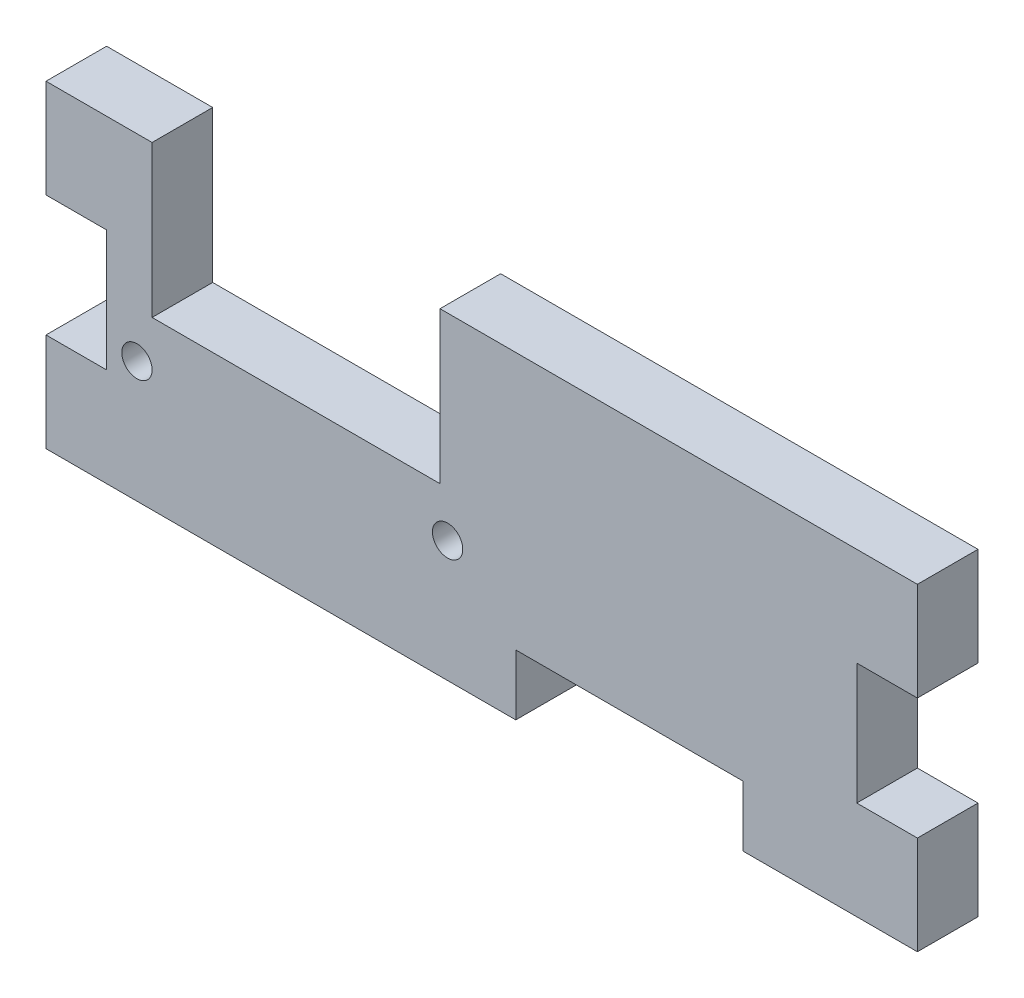
ISO-10303-21;
HEADER;
FILE_DESCRIPTION(('STEP AP214'),'2;1');
FILE_NAME('part.step','',(''),(''),'','','');
FILE_SCHEMA(('AUTOMOTIVE_DESIGN { 1 0 10303 214 1 1 1 1 }'));
ENDSEC;
DATA;
#1=APPLICATION_CONTEXT('core data for automotive mechanical design processes');
#2=APPLICATION_PROTOCOL_DEFINITION('international standard','automotive_design',2000,#1);
#3=PRODUCT_CONTEXT('',#1,'mechanical');
#4=PRODUCT('Part','Part','',(#3));
#5=PRODUCT_RELATED_PRODUCT_CATEGORY('part','',(#4));
#6=PRODUCT_DEFINITION_FORMATION('','',#4);
#7=PRODUCT_DEFINITION_CONTEXT('part definition',#1,'design');
#8=PRODUCT_DEFINITION('design','',#6,#7);
#9=PRODUCT_DEFINITION_SHAPE('','',#8);
#10=(LENGTH_UNIT() NAMED_UNIT(*) SI_UNIT(.MILLI.,.METRE.));
#11=(NAMED_UNIT(*) PLANE_ANGLE_UNIT() SI_UNIT($,.RADIAN.));
#12=(NAMED_UNIT(*) SI_UNIT($,.STERADIAN.) SOLID_ANGLE_UNIT());
#13=UNCERTAINTY_MEASURE_WITH_UNIT(LENGTH_MEASURE(1.E-05),#10,'distance_accuracy_value','');
#14=(GEOMETRIC_REPRESENTATION_CONTEXT(3) GLOBAL_UNCERTAINTY_ASSIGNED_CONTEXT((#13)) GLOBAL_UNIT_ASSIGNED_CONTEXT((#10,
#11,#12)) REPRESENTATION_CONTEXT('',''));
#15=CARTESIAN_POINT('',(0.,0.,0.));
#16=DIRECTION('',(0.,0.,1.));
#17=DIRECTION('',(1.,0.,0.));
#18=AXIS2_PLACEMENT_3D('',#15,#16,#17);
#19=CARTESIAN_POINT('',(0.,-6.,4.));
#20=DIRECTION('',(0.,1.,0.));
#21=DIRECTION('',(-1.,0.,0.));
#22=AXIS2_PLACEMENT_3D('',#19,#20,#21);
#23=PLANE('',#22);
#24=DIRECTION('',(1.,0.,0.));
#25=VECTOR('',#24,1.);
#26=CARTESIAN_POINT('',(0.,-6.,0.));
#27=LINE('',#26,#25);
#28=CARTESIAN_POINT('',(-4.,-6.,0.));
#29=VERTEX_POINT('',#28);
#30=CARTESIAN_POINT('',(27.,-6.,0.));
#31=VERTEX_POINT('',#30);
#32=EDGE_CURVE('E309',#29,#31,#27,.T.);
#33=ORIENTED_EDGE('',*,*,#32,.T.);
#34=DIRECTION('',(0.,0.,1.));
#35=VECTOR('',#34,1.);
#36=CARTESIAN_POINT('',(27.,-6.,4.));
#37=LINE('',#36,#35);
#38=CARTESIAN_POINT('',(27.,-6.,4.));
#39=VERTEX_POINT('',#38);
#40=EDGE_CURVE('E43',#31,#39,#37,.T.);
#41=ORIENTED_EDGE('',*,*,#40,.T.);
#42=DIRECTION('',(1.,0.,0.));
#43=VECTOR('',#42,1.);
#44=CARTESIAN_POINT('',(0.,-6.,4.));
#45=LINE('',#44,#43);
#46=CARTESIAN_POINT('',(-4.,-6.,4.));
#47=VERTEX_POINT('',#46);
#48=EDGE_CURVE('E294',#47,#39,#45,.T.);
#49=ORIENTED_EDGE('',*,*,#48,.F.);
#50=DIRECTION('',(0.,0.,1.));
#51=VECTOR('',#50,1.);
#52=CARTESIAN_POINT('',(-4.,-6.,0.));
#53=LINE('',#52,#51);
#54=EDGE_CURVE('E252',#29,#47,#53,.T.);
#55=ORIENTED_EDGE('',*,*,#54,.F.);
#56=EDGE_LOOP('',(#33,#41,#49,#55));
#57=FACE_BOUND('',#56,.T.);
#58=ADVANCED_FACE('F35',(#57),#23,.F.);
#59=CARTESIAN_POINT('',(0.,0.,4.));
#60=DIRECTION('',(0.,0.,1.));
#61=DIRECTION('',(1.,0.,0.));
#62=AXIS2_PLACEMENT_3D('',#59,#60,#61);
#63=PLANE('',#62);
#64=DIRECTION('',(0.,-1.,0.));
#65=VECTOR('',#64,1.);
#66=CARTESIAN_POINT('',(27.,-6.,4.));
#67=LINE('',#66,#65);
#68=CARTESIAN_POINT('',(27.,-2.,4.));
#69=VERTEX_POINT('',#68);
#70=EDGE_CURVE('E255',#69,#39,#67,.T.);
#71=ORIENTED_EDGE('',*,*,#70,.F.);
#72=DIRECTION('',(-1.,0.,0.));
#73=VECTOR('',#72,1.);
#74=CARTESIAN_POINT('',(27.,-2.,4.));
#75=LINE('',#74,#73);
#76=CARTESIAN_POINT('',(42.,-2.,4.));
#77=VERTEX_POINT('',#76);
#78=EDGE_CURVE('E264',#77,#69,#75,.T.);
#79=ORIENTED_EDGE('',*,*,#78,.F.);
#80=DIRECTION('',(0.,1.,0.));
#81=VECTOR('',#80,1.);
#82=CARTESIAN_POINT('',(42.,-6.,4.));
#83=LINE('',#82,#81);
#84=CARTESIAN_POINT('',(42.,-6.,4.));
#85=VERTEX_POINT('',#84);
#86=EDGE_CURVE('E261',#85,#77,#83,.T.);
#87=ORIENTED_EDGE('',*,*,#86,.F.);
#88=CARTESIAN_POINT('',(53.5,-6.,4.));
#89=VERTEX_POINT('',#88);
#90=EDGE_CURVE('E292',#85,#89,#45,.T.);
#91=ORIENTED_EDGE('',*,*,#90,.T.);
#92=DIRECTION('',(0.,1.,0.));
#93=VECTOR('',#92,1.);
#94=CARTESIAN_POINT('',(53.5,0.499999999999999,4.));
#95=LINE('',#94,#93);
#96=CARTESIAN_POINT('',(53.5,0.499999999999999,4.));
#97=VERTEX_POINT('',#96);
#98=EDGE_CURVE('E196',#89,#97,#95,.T.);
#99=ORIENTED_EDGE('',*,*,#98,.T.);
#100=DIRECTION('',(-1.,0.,0.));
#101=VECTOR('',#100,1.);
#102=CARTESIAN_POINT('',(49.5,0.499999999999999,4.));
#103=LINE('',#102,#101);
#104=CARTESIAN_POINT('',(49.5,0.499999999999999,4.));
#105=VERTEX_POINT('',#104);
#106=EDGE_CURVE('E50',#97,#105,#103,.T.);
#107=ORIENTED_EDGE('',*,*,#106,.T.);
#108=DIRECTION('',(0.,1.,0.));
#109=VECTOR('',#108,1.);
#110=CARTESIAN_POINT('',(49.5,-5.99999999999999,4.));
#111=LINE('',#110,#109);
#112=CARTESIAN_POINT('',(49.5,8.5,4.));
#113=VERTEX_POINT('',#112);
#114=EDGE_CURVE('E55',#105,#113,#111,.T.);
#115=ORIENTED_EDGE('',*,*,#114,.T.);
#116=DIRECTION('',(1.,0.,0.));
#117=VECTOR('',#116,1.);
#118=CARTESIAN_POINT('',(49.5,8.5,4.));
#119=LINE('',#118,#117);
#120=CARTESIAN_POINT('',(53.5,8.5,4.));
#121=VERTEX_POINT('',#120);
#122=EDGE_CURVE('E201',#113,#121,#119,.T.);
#123=ORIENTED_EDGE('',*,*,#122,.T.);
#124=DIRECTION('',(0.,1.,0.));
#125=VECTOR('',#124,1.);
#126=CARTESIAN_POINT('',(53.5,15.,4.));
#127=LINE('',#126,#125);
#128=CARTESIAN_POINT('',(53.5,15.,4.));
#129=VERTEX_POINT('',#128);
#130=EDGE_CURVE('E207',#121,#129,#127,.T.);
#131=ORIENTED_EDGE('',*,*,#130,.T.);
#132=DIRECTION('',(-1.,0.,0.));
#133=VECTOR('',#132,1.);
#134=CARTESIAN_POINT('',(22.,15.,4.));
#135=LINE('',#134,#133);
#136=CARTESIAN_POINT('',(22.,15.,4.));
#137=VERTEX_POINT('',#136);
#138=EDGE_CURVE('E298',#129,#137,#135,.T.);
#139=ORIENTED_EDGE('',*,*,#138,.T.);
#140=DIRECTION('',(0.,-1.,0.));
#141=VECTOR('',#140,1.);
#142=CARTESIAN_POINT('',(22.,5.,4.));
#143=LINE('',#142,#141);
#144=CARTESIAN_POINT('',(22.,5.,4.));
#145=VERTEX_POINT('',#144);
#146=EDGE_CURVE('E300',#137,#145,#143,.T.);
#147=ORIENTED_EDGE('',*,*,#146,.T.);
#148=DIRECTION('',(-1.,0.,0.));
#149=VECTOR('',#148,1.);
#150=CARTESIAN_POINT('',(3.,5.,4.));
#151=LINE('',#150,#149);
#152=CARTESIAN_POINT('',(3.,5.,4.));
#153=VERTEX_POINT('',#152);
#154=EDGE_CURVE('E302',#145,#153,#151,.T.);
#155=ORIENTED_EDGE('',*,*,#154,.T.);
#156=DIRECTION('',(0.,1.,0.));
#157=VECTOR('',#156,1.);
#158=CARTESIAN_POINT('',(3.,5.,4.));
#159=LINE('',#158,#157);
#160=CARTESIAN_POINT('',(3.,15.,4.));
#161=VERTEX_POINT('',#160);
#162=EDGE_CURVE('E304',#153,#161,#159,.T.);
#163=ORIENTED_EDGE('',*,*,#162,.T.);
#164=DIRECTION('',(-1.,0.,0.));
#165=VECTOR('',#164,1.);
#166=CARTESIAN_POINT('',(0.,15.,4.));
#167=LINE('',#166,#165);
#168=CARTESIAN_POINT('',(-4.,15.,4.));
#169=VERTEX_POINT('',#168);
#170=EDGE_CURVE('E306',#161,#169,#167,.T.);
#171=ORIENTED_EDGE('',*,*,#170,.T.);
#172=DIRECTION('',(0.,-1.,0.));
#173=VECTOR('',#172,1.);
#174=CARTESIAN_POINT('',(-4.,8.5,4.));
#175=LINE('',#174,#173);
#176=CARTESIAN_POINT('',(-4.,8.5,4.));
#177=VERTEX_POINT('',#176);
#178=EDGE_CURVE('E217',#169,#177,#175,.T.);
#179=ORIENTED_EDGE('',*,*,#178,.T.);
#180=DIRECTION('',(1.,0.,0.));
#181=VECTOR('',#180,1.);
#182=CARTESIAN_POINT('',(-4.,8.5,4.));
#183=LINE('',#182,#181);
#184=CARTESIAN_POINT('',(0.,8.5,4.));
#185=VERTEX_POINT('',#184);
#186=EDGE_CURVE('E226',#177,#185,#183,.T.);
#187=ORIENTED_EDGE('',*,*,#186,.T.);
#188=DIRECTION('',(0.,-1.,0.));
#189=VECTOR('',#188,1.);
#190=CARTESIAN_POINT('',(0.,0.,4.));
#191=LINE('',#190,#189);
#192=CARTESIAN_POINT('',(0.,0.499999999999999,4.));
#193=VERTEX_POINT('',#192);
#194=EDGE_CURVE('E290',#185,#193,#191,.T.);
#195=ORIENTED_EDGE('',*,*,#194,.T.);
#196=DIRECTION('',(-1.,0.,0.));
#197=VECTOR('',#196,1.);
#198=CARTESIAN_POINT('',(-4.,0.499999999999999,4.));
#199=LINE('',#198,#197);
#200=CARTESIAN_POINT('',(-4.,0.499999999999999,4.));
#201=VERTEX_POINT('',#200);
#202=EDGE_CURVE('E235',#193,#201,#199,.T.);
#203=ORIENTED_EDGE('',*,*,#202,.T.);
#204=DIRECTION('',(0.,-1.,0.));
#205=VECTOR('',#204,1.);
#206=CARTESIAN_POINT('',(-4.,-6.,4.));
#207=LINE('',#206,#205);
#208=EDGE_CURVE('E244',#201,#47,#207,.T.);
#209=ORIENTED_EDGE('',*,*,#208,.T.);
#210=ORIENTED_EDGE('',*,*,#48,.T.);
#211=EDGE_LOOP('',(#71,#79,#87,#91,#99,#107,#115,#123,#131,#139,#147,#155,#163,#171,#179,#187,
#195,#203,#209,#210));
#212=FACE_BOUND('',#211,.T.);
#213=CARTESIAN_POINT('',(22.5,2.,4.));
#214=DIRECTION('',(0.,0.,1.));
#215=DIRECTION('',(1.,0.,0.));
#216=AXIS2_PLACEMENT_3D('',#213,#214,#215);
#217=CIRCLE('',#216,1.);
#218=CARTESIAN_POINT('',(23.5,2.,4.));
#219=VERTEX_POINT('',#218);
#220=EDGE_CURVE('E284',#219,#219,#217,.T.);
#221=ORIENTED_EDGE('',*,*,#220,.F.);
#222=EDGE_LOOP('',(#221));
#223=FACE_BOUND('',#222,.T.);
#224=CARTESIAN_POINT('',(2.,2.,4.));
#225=DIRECTION('',(0.,0.,1.));
#226=DIRECTION('',(-1.,0.,0.));
#227=AXIS2_PLACEMENT_3D('',#224,#225,#226);
#228=CIRCLE('',#227,1.);
#229=CARTESIAN_POINT('',(1.,2.,4.));
#230=VERTEX_POINT('',#229);
#231=EDGE_CURVE('E278',#230,#230,#228,.T.);
#232=ORIENTED_EDGE('',*,*,#231,.F.);
#233=EDGE_LOOP('',(#232));
#234=FACE_BOUND('',#233,.T.);
#235=ADVANCED_FACE('F342',(#212,#223,#234),#63,.T.);
#236=CARTESIAN_POINT('',(0.,0.,0.));
#237=DIRECTION('',(0.,0.,1.));
#238=DIRECTION('',(1.,0.,0.));
#239=AXIS2_PLACEMENT_3D('',#236,#237,#238);
#240=PLANE('',#239);
#241=DIRECTION('',(-1.,0.,0.));
#242=VECTOR('',#241,1.);
#243=CARTESIAN_POINT('',(0.,-2.,0.));
#244=LINE('',#243,#242);
#245=CARTESIAN_POINT('',(42.,-2.,0.));
#246=VERTEX_POINT('',#245);
#247=CARTESIAN_POINT('',(27.,-2.,0.));
#248=VERTEX_POINT('',#247);
#249=EDGE_CURVE('E11',#246,#248,#244,.T.);
#250=ORIENTED_EDGE('',*,*,#249,.T.);
#251=DIRECTION('',(0.,-1.,0.));
#252=VECTOR('',#251,1.);
#253=CARTESIAN_POINT('',(27.,0.,0.));
#254=LINE('',#253,#252);
#255=EDGE_CURVE('E274',#248,#31,#254,.T.);
#256=ORIENTED_EDGE('',*,*,#255,.T.);
#257=ORIENTED_EDGE('',*,*,#32,.F.);
#258=DIRECTION('',(0.,-1.,0.));
#259=VECTOR('',#258,1.);
#260=CARTESIAN_POINT('',(-4.,-6.,0.));
#261=LINE('',#260,#259);
#262=CARTESIAN_POINT('',(-4.,0.499999999999999,0.));
#263=VERTEX_POINT('',#262);
#264=EDGE_CURVE('E243',#263,#29,#261,.T.);
#265=ORIENTED_EDGE('',*,*,#264,.F.);
#266=DIRECTION('',(-1.,0.,0.));
#267=VECTOR('',#266,1.);
#268=CARTESIAN_POINT('',(-4.,0.499999999999999,0.));
#269=LINE('',#268,#267);
#270=CARTESIAN_POINT('',(0.,0.499999999999999,0.));
#271=VERTEX_POINT('',#270);
#272=EDGE_CURVE('E240',#271,#263,#269,.T.);
#273=ORIENTED_EDGE('',*,*,#272,.F.);
#274=DIRECTION('',(0.,-1.,0.));
#275=VECTOR('',#274,1.);
#276=CARTESIAN_POINT('',(0.,0.,0.));
#277=LINE('',#276,#275);
#278=CARTESIAN_POINT('',(0.,8.5,0.));
#279=VERTEX_POINT('',#278);
#280=EDGE_CURVE('E293',#279,#271,#277,.T.);
#281=ORIENTED_EDGE('',*,*,#280,.F.);
#282=DIRECTION('',(1.,0.,0.));
#283=VECTOR('',#282,1.);
#284=CARTESIAN_POINT('',(-4.,8.5,0.));
#285=LINE('',#284,#283);
#286=CARTESIAN_POINT('',(-4.,8.5,0.));
#287=VERTEX_POINT('',#286);
#288=EDGE_CURVE('E225',#287,#279,#285,.T.);
#289=ORIENTED_EDGE('',*,*,#288,.F.);
#290=DIRECTION('',(0.,-1.,0.));
#291=VECTOR('',#290,1.);
#292=CARTESIAN_POINT('',(-4.,8.5,0.));
#293=LINE('',#292,#291);
#294=CARTESIAN_POINT('',(-4.,15.,0.));
#295=VERTEX_POINT('',#294);
#296=EDGE_CURVE('E222',#295,#287,#293,.T.);
#297=ORIENTED_EDGE('',*,*,#296,.F.);
#298=DIRECTION('',(-1.,0.,0.));
#299=VECTOR('',#298,1.);
#300=CARTESIAN_POINT('',(0.,15.,0.));
#301=LINE('',#300,#299);
#302=CARTESIAN_POINT('',(3.,15.,0.));
#303=VERTEX_POINT('',#302);
#304=EDGE_CURVE('E321',#303,#295,#301,.T.);
#305=ORIENTED_EDGE('',*,*,#304,.F.);
#306=DIRECTION('',(0.,1.,0.));
#307=VECTOR('',#306,1.);
#308=CARTESIAN_POINT('',(3.,5.,0.));
#309=LINE('',#308,#307);
#310=CARTESIAN_POINT('',(3.,5.,0.));
#311=VERTEX_POINT('',#310);
#312=EDGE_CURVE('E319',#311,#303,#309,.T.);
#313=ORIENTED_EDGE('',*,*,#312,.F.);
#314=DIRECTION('',(-1.,0.,0.));
#315=VECTOR('',#314,1.);
#316=CARTESIAN_POINT('',(3.,5.,0.));
#317=LINE('',#316,#315);
#318=CARTESIAN_POINT('',(22.,5.,0.));
#319=VERTEX_POINT('',#318);
#320=EDGE_CURVE('E317',#319,#311,#317,.T.);
#321=ORIENTED_EDGE('',*,*,#320,.F.);
#322=DIRECTION('',(0.,-1.,0.));
#323=VECTOR('',#322,1.);
#324=CARTESIAN_POINT('',(22.,5.,0.));
#325=LINE('',#324,#323);
#326=CARTESIAN_POINT('',(22.,15.,0.));
#327=VERTEX_POINT('',#326);
#328=EDGE_CURVE('E315',#327,#319,#325,.T.);
#329=ORIENTED_EDGE('',*,*,#328,.F.);
#330=DIRECTION('',(-1.,0.,0.));
#331=VECTOR('',#330,1.);
#332=CARTESIAN_POINT('',(22.,15.,0.));
#333=LINE('',#332,#331);
#334=CARTESIAN_POINT('',(53.5,15.,0.));
#335=VERTEX_POINT('',#334);
#336=EDGE_CURVE('E313',#335,#327,#333,.T.);
#337=ORIENTED_EDGE('',*,*,#336,.F.);
#338=DIRECTION('',(0.,1.,0.));
#339=VECTOR('',#338,1.);
#340=CARTESIAN_POINT('',(53.5,15.,0.));
#341=LINE('',#340,#339);
#342=CARTESIAN_POINT('',(53.5,8.5,0.));
#343=VERTEX_POINT('',#342);
#344=EDGE_CURVE('E206',#343,#335,#341,.T.);
#345=ORIENTED_EDGE('',*,*,#344,.F.);
#346=DIRECTION('',(1.,0.,0.));
#347=VECTOR('',#346,1.);
#348=CARTESIAN_POINT('',(49.5,8.5,0.));
#349=LINE('',#348,#347);
#350=CARTESIAN_POINT('',(49.5,8.5,0.));
#351=VERTEX_POINT('',#350);
#352=EDGE_CURVE('E203',#351,#343,#349,.T.);
#353=ORIENTED_EDGE('',*,*,#352,.F.);
#354=DIRECTION('',(0.,1.,0.));
#355=VECTOR('',#354,1.);
#356=CARTESIAN_POINT('',(49.5,-5.99999999999999,0.));
#357=LINE('',#356,#355);
#358=CARTESIAN_POINT('',(49.5,0.499999999999999,0.));
#359=VERTEX_POINT('',#358);
#360=EDGE_CURVE('E189',#359,#351,#357,.T.);
#361=ORIENTED_EDGE('',*,*,#360,.F.);
#362=DIRECTION('',(-1.,0.,0.));
#363=VECTOR('',#362,1.);
#364=CARTESIAN_POINT('',(49.5,0.499999999999999,0.));
#365=LINE('',#364,#363);
#366=CARTESIAN_POINT('',(53.5,0.499999999999999,0.));
#367=VERTEX_POINT('',#366);
#368=EDGE_CURVE('E174',#367,#359,#365,.T.);
#369=ORIENTED_EDGE('',*,*,#368,.F.);
#370=DIRECTION('',(0.,1.,0.));
#371=VECTOR('',#370,1.);
#372=CARTESIAN_POINT('',(53.5,0.499999999999999,0.));
#373=LINE('',#372,#371);
#374=CARTESIAN_POINT('',(53.5,-6.,0.));
#375=VERTEX_POINT('',#374);
#376=EDGE_CURVE('E187',#375,#367,#373,.T.);
#377=ORIENTED_EDGE('',*,*,#376,.F.);
#378=CARTESIAN_POINT('',(42.,-5.99999999999999,0.));
#379=VERTEX_POINT('',#378);
#380=EDGE_CURVE('E287',#379,#375,#27,.T.);
#381=ORIENTED_EDGE('',*,*,#380,.F.);
#382=DIRECTION('',(0.,1.,0.));
#383=VECTOR('',#382,1.);
#384=CARTESIAN_POINT('',(42.,0.,0.));
#385=LINE('',#384,#383);
#386=EDGE_CURVE('E270',#379,#246,#385,.T.);
#387=ORIENTED_EDGE('',*,*,#386,.T.);
#388=EDGE_LOOP('',(#250,#256,#257,#265,#273,#281,#289,#297,#305,#313,#321,#329,#337,#345,#353,
#361,#369,#377,#381,#387));
#389=FACE_BOUND('',#388,.T.);
#390=CARTESIAN_POINT('',(22.5,2.,0.));
#391=DIRECTION('',(0.,0.,1.));
#392=DIRECTION('',(1.,0.,0.));
#393=AXIS2_PLACEMENT_3D('',#390,#391,#392);
#394=CIRCLE('',#393,1.);
#395=CARTESIAN_POINT('',(23.5,2.,0.));
#396=VERTEX_POINT('',#395);
#397=EDGE_CURVE('E281',#396,#396,#394,.T.);
#398=ORIENTED_EDGE('',*,*,#397,.T.);
#399=EDGE_LOOP('',(#398));
#400=FACE_BOUND('',#399,.T.);
#401=CARTESIAN_POINT('',(2.,2.,0.));
#402=DIRECTION('',(0.,0.,1.));
#403=DIRECTION('',(-1.,0.,0.));
#404=AXIS2_PLACEMENT_3D('',#401,#402,#403);
#405=CIRCLE('',#404,1.);
#406=CARTESIAN_POINT('',(1.,2.,0.));
#407=VERTEX_POINT('',#406);
#408=EDGE_CURVE('E277',#407,#407,#405,.T.);
#409=ORIENTED_EDGE('',*,*,#408,.T.);
#410=EDGE_LOOP('',(#409));
#411=FACE_BOUND('',#410,.T.);
#412=ADVANCED_FACE('F184',(#389,#400,#411),#240,.F.);
#413=ORIENTED_EDGE('',*,*,#90,.F.);
#414=DIRECTION('',(0.,0.,-1.));
#415=VECTOR('',#414,1.);
#416=CARTESIAN_POINT('',(42.,-5.99999999999999,4.));
#417=LINE('',#416,#415);
#418=EDGE_CURVE('E335',#85,#379,#417,.T.);
#419=ORIENTED_EDGE('',*,*,#418,.T.);
#420=ORIENTED_EDGE('',*,*,#380,.T.);
#421=DIRECTION('',(0.,0.,1.));
#422=VECTOR('',#421,1.);
#423=CARTESIAN_POINT('',(53.5,-6.,0.));
#424=LINE('',#423,#422);
#425=EDGE_CURVE('E194',#375,#89,#424,.T.);
#426=ORIENTED_EDGE('',*,*,#425,.T.);
#427=EDGE_LOOP('',(#413,#419,#420,#426));
#428=FACE_BOUND('',#427,.T.);
#429=ADVANCED_FACE('F37',(#428),#23,.F.);
#430=CARTESIAN_POINT('',(49.5,-5.99999999999999,4.));
#431=DIRECTION('',(-1.,0.,0.));
#432=DIRECTION('',(0.,0.,1.));
#433=AXIS2_PLACEMENT_3D('',#430,#431,#432);
#434=PLANE('',#433);
#435=ORIENTED_EDGE('',*,*,#114,.F.);
#436=DIRECTION('',(0.,0.,1.));
#437=VECTOR('',#436,1.);
#438=CARTESIAN_POINT('',(49.5,0.499999999999999,0.));
#439=LINE('',#438,#437);
#440=EDGE_CURVE('E179',#359,#105,#439,.T.);
#441=ORIENTED_EDGE('',*,*,#440,.F.);
#442=ORIENTED_EDGE('',*,*,#360,.T.);
#443=DIRECTION('',(0.,0.,1.));
#444=VECTOR('',#443,1.);
#445=CARTESIAN_POINT('',(49.5,8.5,0.));
#446=LINE('',#445,#444);
#447=EDGE_CURVE('E210',#351,#113,#446,.T.);
#448=ORIENTED_EDGE('',*,*,#447,.T.);
#449=EDGE_LOOP('',(#435,#441,#442,#448));
#450=FACE_BOUND('',#449,.T.);
#451=ADVANCED_FACE('F398',(#450),#434,.F.);
#452=CARTESIAN_POINT('',(22.,15.,4.));
#453=DIRECTION('',(0.,-1.,0.));
#454=DIRECTION('',(1.,0.,0.));
#455=AXIS2_PLACEMENT_3D('',#452,#453,#454);
#456=PLANE('',#455);
#457=ORIENTED_EDGE('',*,*,#336,.T.);
#458=DIRECTION('',(0.,0.,-1.));
#459=VECTOR('',#458,1.);
#460=CARTESIAN_POINT('',(22.,15.,4.));
#461=LINE('',#460,#459);
#462=EDGE_CURVE('E332',#137,#327,#461,.T.);
#463=ORIENTED_EDGE('',*,*,#462,.F.);
#464=ORIENTED_EDGE('',*,*,#138,.F.);
#465=DIRECTION('',(0.,0.,1.));
#466=VECTOR('',#465,1.);
#467=CARTESIAN_POINT('',(53.5,15.,0.));
#468=LINE('',#467,#466);
#469=EDGE_CURVE('E214',#335,#129,#468,.T.);
#470=ORIENTED_EDGE('',*,*,#469,.F.);
#471=EDGE_LOOP('',(#457,#463,#464,#470));
#472=FACE_BOUND('',#471,.T.);
#473=ADVANCED_FACE('F390',(#472),#456,.F.);
#474=CARTESIAN_POINT('',(22.,5.,4.));
#475=DIRECTION('',(1.,0.,0.));
#476=DIRECTION('',(0.,0.,-1.));
#477=AXIS2_PLACEMENT_3D('',#474,#475,#476);
#478=PLANE('',#477);
#479=ORIENTED_EDGE('',*,*,#328,.T.);
#480=DIRECTION('',(0.,0.,-1.));
#481=VECTOR('',#480,1.);
#482=CARTESIAN_POINT('',(22.,5.,4.));
#483=LINE('',#482,#481);
#484=EDGE_CURVE('E329',#145,#319,#483,.T.);
#485=ORIENTED_EDGE('',*,*,#484,.F.);
#486=ORIENTED_EDGE('',*,*,#146,.F.);
#487=ORIENTED_EDGE('',*,*,#462,.T.);
#488=EDGE_LOOP('',(#479,#485,#486,#487));
#489=FACE_BOUND('',#488,.T.);
#490=ADVANCED_FACE('F385',(#489),#478,.F.);
#491=CARTESIAN_POINT('',(3.,5.,4.));
#492=DIRECTION('',(0.,-1.,0.));
#493=DIRECTION('',(0.,0.,-1.));
#494=AXIS2_PLACEMENT_3D('',#491,#492,#493);
#495=PLANE('',#494);
#496=ORIENTED_EDGE('',*,*,#320,.T.);
#497=DIRECTION('',(0.,0.,-1.));
#498=VECTOR('',#497,1.);
#499=CARTESIAN_POINT('',(3.,5.,4.));
#500=LINE('',#499,#498);
#501=EDGE_CURVE('E326',#153,#311,#500,.T.);
#502=ORIENTED_EDGE('',*,*,#501,.F.);
#503=ORIENTED_EDGE('',*,*,#154,.F.);
#504=ORIENTED_EDGE('',*,*,#484,.T.);
#505=EDGE_LOOP('',(#496,#502,#503,#504));
#506=FACE_BOUND('',#505,.T.);
#507=ADVANCED_FACE('F381',(#506),#495,.F.);
#508=CARTESIAN_POINT('',(3.,5.,4.));
#509=DIRECTION('',(-1.,0.,0.));
#510=DIRECTION('',(0.,0.,1.));
#511=AXIS2_PLACEMENT_3D('',#508,#509,#510);
#512=PLANE('',#511);
#513=ORIENTED_EDGE('',*,*,#312,.T.);
#514=DIRECTION('',(0.,0.,-1.));
#515=VECTOR('',#514,1.);
#516=CARTESIAN_POINT('',(3.,15.,4.));
#517=LINE('',#516,#515);
#518=EDGE_CURVE('E308',#161,#303,#517,.T.);
#519=ORIENTED_EDGE('',*,*,#518,.F.);
#520=ORIENTED_EDGE('',*,*,#162,.F.);
#521=ORIENTED_EDGE('',*,*,#501,.T.);
#522=EDGE_LOOP('',(#513,#519,#520,#521));
#523=FACE_BOUND('',#522,.T.);
#524=ADVANCED_FACE('F376',(#523),#512,.F.);
#525=CARTESIAN_POINT('',(0.,15.,4.));
#526=DIRECTION('',(0.,-1.,0.));
#527=DIRECTION('',(0.,0.,-1.));
#528=AXIS2_PLACEMENT_3D('',#525,#526,#527);
#529=PLANE('',#528);
#530=ORIENTED_EDGE('',*,*,#304,.T.);
#531=DIRECTION('',(0.,0.,1.));
#532=VECTOR('',#531,1.);
#533=CARTESIAN_POINT('',(-4.,15.,0.));
#534=LINE('',#533,#532);
#535=EDGE_CURVE('E232',#295,#169,#534,.T.);
#536=ORIENTED_EDGE('',*,*,#535,.T.);
#537=ORIENTED_EDGE('',*,*,#170,.F.);
#538=ORIENTED_EDGE('',*,*,#518,.T.);
#539=EDGE_LOOP('',(#530,#536,#537,#538));
#540=FACE_BOUND('',#539,.T.);
#541=ADVANCED_FACE('F370',(#540),#529,.F.);
#542=CARTESIAN_POINT('',(0.,0.,4.));
#543=DIRECTION('',(1.,0.,0.));
#544=DIRECTION('',(0.,0.,-1.));
#545=AXIS2_PLACEMENT_3D('',#542,#543,#544);
#546=PLANE('',#545);
#547=ORIENTED_EDGE('',*,*,#194,.F.);
#548=DIRECTION('',(0.,0.,1.));
#549=VECTOR('',#548,1.);
#550=CARTESIAN_POINT('',(0.,8.5,0.));
#551=LINE('',#550,#549);
#552=EDGE_CURVE('E236',#279,#185,#551,.T.);
#553=ORIENTED_EDGE('',*,*,#552,.F.);
#554=ORIENTED_EDGE('',*,*,#280,.T.);
#555=DIRECTION('',(0.,0.,1.));
#556=VECTOR('',#555,1.);
#557=CARTESIAN_POINT('',(0.,0.499999999999999,0.));
#558=LINE('',#557,#556);
#559=EDGE_CURVE('E247',#271,#193,#558,.T.);
#560=ORIENTED_EDGE('',*,*,#559,.T.);
#561=EDGE_LOOP('',(#547,#553,#554,#560));
#562=FACE_BOUND('',#561,.T.);
#563=ADVANCED_FACE('F357',(#562),#546,.F.);
#564=CARTESIAN_POINT('',(22.5,2.,4.));
#565=DIRECTION('',(0.,0.,-1.));
#566=DIRECTION('',(-1.,0.,0.));
#567=AXIS2_PLACEMENT_3D('',#564,#565,#566);
#568=CYLINDRICAL_SURFACE('',#567,1.);
#569=ORIENTED_EDGE('',*,*,#220,.T.);
#570=EDGE_LOOP('',(#569));
#571=FACE_BOUND('',#570,.T.);
#572=ORIENTED_EDGE('',*,*,#397,.F.);
#573=EDGE_LOOP('',(#572));
#574=FACE_BOUND('',#573,.T.);
#575=ADVANCED_FACE('F416',(#571,#574),#568,.F.);
#576=CARTESIAN_POINT('',(2.,2.,4.));
#577=DIRECTION('',(0.,0.,-1.));
#578=DIRECTION('',(-1.,0.,0.));
#579=AXIS2_PLACEMENT_3D('',#576,#577,#578);
#580=CYLINDRICAL_SURFACE('',#579,1.);
#581=ORIENTED_EDGE('',*,*,#231,.T.);
#582=EDGE_LOOP('',(#581));
#583=FACE_BOUND('',#582,.T.);
#584=ORIENTED_EDGE('',*,*,#408,.F.);
#585=EDGE_LOOP('',(#584));
#586=FACE_BOUND('',#585,.T.);
#587=ADVANCED_FACE('F455',(#583,#586),#580,.F.);
#588=CARTESIAN_POINT('',(27.,-2.,-6.));
#589=DIRECTION('',(0.,1.,0.));
#590=DIRECTION('',(0.,0.,1.));
#591=AXIS2_PLACEMENT_3D('',#588,#589,#590);
#592=PLANE('',#591);
#593=DIRECTION('',(0.,0.,1.));
#594=VECTOR('',#593,1.);
#595=CARTESIAN_POINT('',(42.,-2.,-6.));
#596=LINE('',#595,#594);
#597=EDGE_CURVE('E267',#246,#77,#596,.T.);
#598=ORIENTED_EDGE('',*,*,#597,.T.);
#599=ORIENTED_EDGE('',*,*,#78,.T.);
#600=DIRECTION('',(0.,0.,1.));
#601=VECTOR('',#600,1.);
#602=CARTESIAN_POINT('',(27.,-2.,-6.));
#603=LINE('',#602,#601);
#604=EDGE_CURVE('E268',#248,#69,#603,.T.);
#605=ORIENTED_EDGE('',*,*,#604,.F.);
#606=ORIENTED_EDGE('',*,*,#249,.F.);
#607=EDGE_LOOP('',(#598,#599,#605,#606));
#608=FACE_BOUND('',#607,.T.);
#609=ADVANCED_FACE('F462',(#608),#592,.F.);
#610=CARTESIAN_POINT('',(27.,-6.,-6.));
#611=DIRECTION('',(-1.,0.,0.));
#612=DIRECTION('',(0.,0.,1.));
#613=AXIS2_PLACEMENT_3D('',#610,#611,#612);
#614=PLANE('',#613);
#615=ORIENTED_EDGE('',*,*,#604,.T.);
#616=ORIENTED_EDGE('',*,*,#70,.T.);
#617=ORIENTED_EDGE('',*,*,#40,.F.);
#618=ORIENTED_EDGE('',*,*,#255,.F.);
#619=EDGE_LOOP('',(#615,#616,#617,#618));
#620=FACE_BOUND('',#619,.T.);
#621=ADVANCED_FACE('F469',(#620),#614,.F.);
#622=CARTESIAN_POINT('',(42.,-6.,-6.));
#623=DIRECTION('',(1.,0.,0.));
#624=DIRECTION('',(0.,0.,-1.));
#625=AXIS2_PLACEMENT_3D('',#622,#623,#624);
#626=PLANE('',#625);
#627=ORIENTED_EDGE('',*,*,#418,.F.);
#628=ORIENTED_EDGE('',*,*,#86,.T.);
#629=ORIENTED_EDGE('',*,*,#597,.F.);
#630=ORIENTED_EDGE('',*,*,#386,.F.);
#631=EDGE_LOOP('',(#627,#628,#629,#630));
#632=FACE_BOUND('',#631,.T.);
#633=ADVANCED_FACE('F477',(#632),#626,.F.);
#634=CARTESIAN_POINT('',(-4.,-6.,0.));
#635=DIRECTION('',(-1.,0.,0.));
#636=DIRECTION('',(0.,0.,1.));
#637=AXIS2_PLACEMENT_3D('',#634,#635,#636);
#638=PLANE('',#637);
#639=ORIENTED_EDGE('',*,*,#208,.F.);
#640=DIRECTION('',(0.,0.,1.));
#641=VECTOR('',#640,1.);
#642=CARTESIAN_POINT('',(-4.,0.499999999999999,0.));
#643=LINE('',#642,#641);
#644=EDGE_CURVE('E256',#263,#201,#643,.T.);
#645=ORIENTED_EDGE('',*,*,#644,.F.);
#646=ORIENTED_EDGE('',*,*,#264,.T.);
#647=ORIENTED_EDGE('',*,*,#54,.T.);
#648=EDGE_LOOP('',(#639,#645,#646,#647));
#649=FACE_BOUND('',#648,.T.);
#650=ADVANCED_FACE('F348',(#649),#638,.T.);
#651=CARTESIAN_POINT('',(-4.,0.499999999999999,0.));
#652=DIRECTION('',(0.,1.,0.));
#653=DIRECTION('',(0.,0.,1.));
#654=AXIS2_PLACEMENT_3D('',#651,#652,#653);
#655=PLANE('',#654);
#656=ORIENTED_EDGE('',*,*,#202,.F.);
#657=ORIENTED_EDGE('',*,*,#559,.F.);
#658=ORIENTED_EDGE('',*,*,#272,.T.);
#659=ORIENTED_EDGE('',*,*,#644,.T.);
#660=EDGE_LOOP('',(#656,#657,#658,#659));
#661=FACE_BOUND('',#660,.T.);
#662=ADVANCED_FACE('F354',(#661),#655,.T.);
#663=CARTESIAN_POINT('',(-4.,8.5,0.));
#664=DIRECTION('',(-1.,0.,0.));
#665=DIRECTION('',(0.,0.,1.));
#666=AXIS2_PLACEMENT_3D('',#663,#664,#665);
#667=PLANE('',#666);
#668=ORIENTED_EDGE('',*,*,#178,.F.);
#669=ORIENTED_EDGE('',*,*,#535,.F.);
#670=ORIENTED_EDGE('',*,*,#296,.T.);
#671=DIRECTION('',(0.,0.,1.));
#672=VECTOR('',#671,1.);
#673=CARTESIAN_POINT('',(-4.,8.5,0.));
#674=LINE('',#673,#672);
#675=EDGE_CURVE('E228',#287,#177,#674,.T.);
#676=ORIENTED_EDGE('',*,*,#675,.T.);
#677=EDGE_LOOP('',(#668,#669,#670,#676));
#678=FACE_BOUND('',#677,.T.);
#679=ADVANCED_FACE('F366',(#678),#667,.T.);
#680=CARTESIAN_POINT('',(-4.,8.5,0.));
#681=DIRECTION('',(0.,-1.,0.));
#682=DIRECTION('',(0.,0.,-1.));
#683=AXIS2_PLACEMENT_3D('',#680,#681,#682);
#684=PLANE('',#683);
#685=ORIENTED_EDGE('',*,*,#186,.F.);
#686=ORIENTED_EDGE('',*,*,#675,.F.);
#687=ORIENTED_EDGE('',*,*,#288,.T.);
#688=ORIENTED_EDGE('',*,*,#552,.T.);
#689=EDGE_LOOP('',(#685,#686,#687,#688));
#690=FACE_BOUND('',#689,.T.);
#691=ADVANCED_FACE('F502',(#690),#684,.T.);
#692=CARTESIAN_POINT('',(53.5,15.,0.));
#693=DIRECTION('',(1.,0.,0.));
#694=DIRECTION('',(0.,0.,-1.));
#695=AXIS2_PLACEMENT_3D('',#692,#693,#694);
#696=PLANE('',#695);
#697=ORIENTED_EDGE('',*,*,#130,.F.);
#698=DIRECTION('',(0.,0.,1.));
#699=VECTOR('',#698,1.);
#700=CARTESIAN_POINT('',(53.5,8.5,0.));
#701=LINE('',#700,#699);
#702=EDGE_CURVE('E218',#343,#121,#701,.T.);
#703=ORIENTED_EDGE('',*,*,#702,.F.);
#704=ORIENTED_EDGE('',*,*,#344,.T.);
#705=ORIENTED_EDGE('',*,*,#469,.T.);
#706=EDGE_LOOP('',(#697,#703,#704,#705));
#707=FACE_BOUND('',#706,.T.);
#708=ADVANCED_FACE('F393',(#707),#696,.T.);
#709=CARTESIAN_POINT('',(49.5,8.5,0.));
#710=DIRECTION('',(0.,-1.,0.));
#711=DIRECTION('',(0.,0.,-1.));
#712=AXIS2_PLACEMENT_3D('',#709,#710,#711);
#713=PLANE('',#712);
#714=ORIENTED_EDGE('',*,*,#122,.F.);
#715=ORIENTED_EDGE('',*,*,#447,.F.);
#716=ORIENTED_EDGE('',*,*,#352,.T.);
#717=ORIENTED_EDGE('',*,*,#702,.T.);
#718=EDGE_LOOP('',(#714,#715,#716,#717));
#719=FACE_BOUND('',#718,.T.);
#720=ADVANCED_FACE('F395',(#719),#713,.T.);
#721=CARTESIAN_POINT('',(53.5,0.499999999999999,0.));
#722=DIRECTION('',(1.,0.,0.));
#723=DIRECTION('',(0.,0.,-1.));
#724=AXIS2_PLACEMENT_3D('',#721,#722,#723);
#725=PLANE('',#724);
#726=ORIENTED_EDGE('',*,*,#98,.F.);
#727=ORIENTED_EDGE('',*,*,#425,.F.);
#728=ORIENTED_EDGE('',*,*,#376,.T.);
#729=DIRECTION('',(0.,0.,1.));
#730=VECTOR('',#729,1.);
#731=CARTESIAN_POINT('',(53.5,0.499999999999999,0.));
#732=LINE('',#731,#730);
#733=EDGE_CURVE('E171',#367,#97,#732,.T.);
#734=ORIENTED_EDGE('',*,*,#733,.T.);
#735=EDGE_LOOP('',(#726,#727,#728,#734));
#736=FACE_BOUND('',#735,.T.);
#737=ADVANCED_FACE('F192',(#736),#725,.T.);
#738=CARTESIAN_POINT('',(49.5,0.499999999999999,0.));
#739=DIRECTION('',(0.,1.,0.));
#740=DIRECTION('',(0.,0.,1.));
#741=AXIS2_PLACEMENT_3D('',#738,#739,#740);
#742=PLANE('',#741);
#743=ORIENTED_EDGE('',*,*,#106,.F.);
#744=ORIENTED_EDGE('',*,*,#733,.F.);
#745=ORIENTED_EDGE('',*,*,#368,.T.);
#746=ORIENTED_EDGE('',*,*,#440,.T.);
#747=EDGE_LOOP('',(#743,#744,#745,#746));
#748=FACE_BOUND('',#747,.T.);
#749=ADVANCED_FACE('F173',(#748),#742,.T.);
#750=CLOSED_SHELL('',(#58,#235,#412,#429,#451,#473,#490,#507,#524,#541,#563,#575,#587,#609,#621,
#633,#650,#662,#679,#691,#708,#720,#737,#749));
#751=MANIFOLD_SOLID_BREP('B2',#750);
#752=ADVANCED_BREP_SHAPE_REPRESENTATION('',(#18,#751),#14);
#753=SHAPE_DEFINITION_REPRESENTATION(#9,#752);
ENDSEC;
END-ISO-10303-21;
